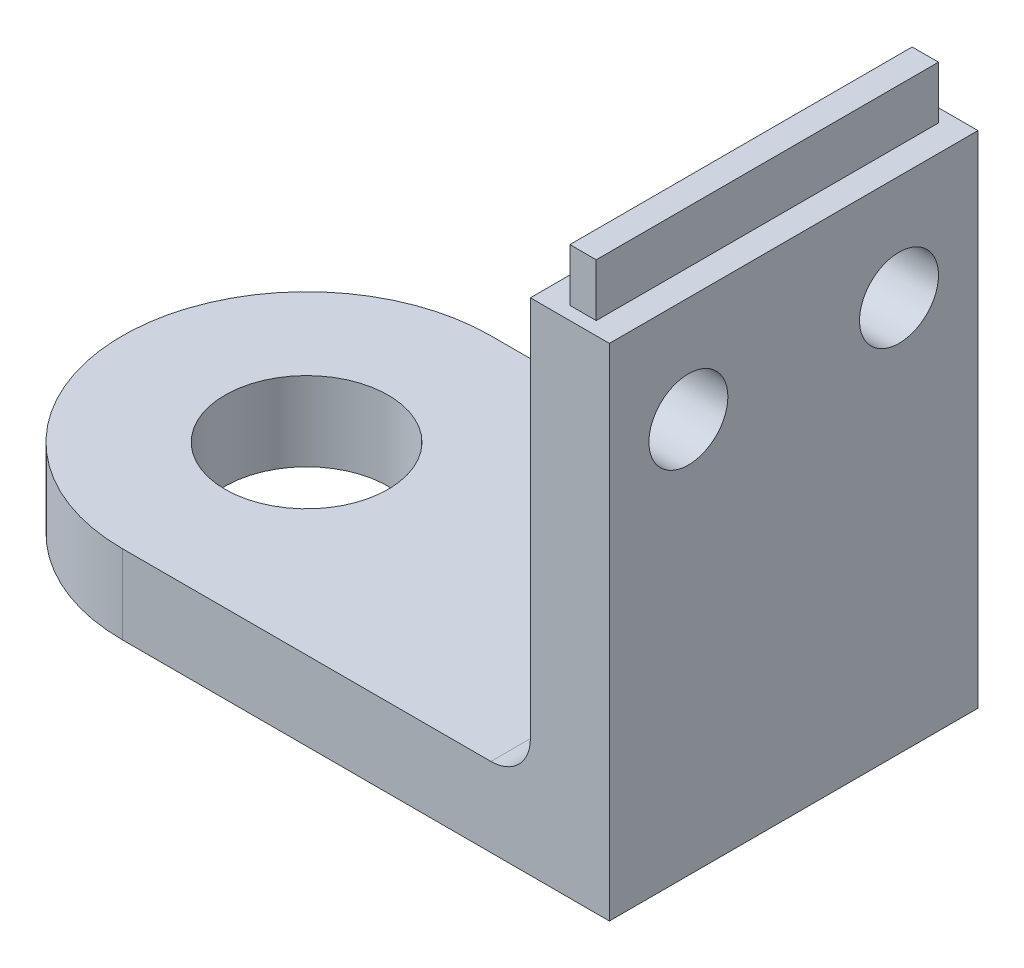
ISO-10303-21;
HEADER;
FILE_DESCRIPTION(('STEP AP214'),'2;1');
FILE_NAME('part.step','',(''),(''),'','','');
FILE_SCHEMA(('AUTOMOTIVE_DESIGN { 1 0 10303 214 1 1 1 1 }'));
ENDSEC;
DATA;
#1=APPLICATION_CONTEXT('core data for automotive mechanical design processes');
#2=APPLICATION_PROTOCOL_DEFINITION('international standard','automotive_design',2000,#1);
#3=PRODUCT_CONTEXT('',#1,'mechanical');
#4=PRODUCT('Part','Part','',(#3));
#5=PRODUCT_RELATED_PRODUCT_CATEGORY('part','',(#4));
#6=PRODUCT_DEFINITION_FORMATION('','',#4);
#7=PRODUCT_DEFINITION_CONTEXT('part definition',#1,'design');
#8=PRODUCT_DEFINITION('design','',#6,#7);
#9=PRODUCT_DEFINITION_SHAPE('','',#8);
#10=(LENGTH_UNIT() NAMED_UNIT(*) SI_UNIT(.MILLI.,.METRE.));
#11=(NAMED_UNIT(*) PLANE_ANGLE_UNIT() SI_UNIT($,.RADIAN.));
#12=(NAMED_UNIT(*) SI_UNIT($,.STERADIAN.) SOLID_ANGLE_UNIT());
#13=UNCERTAINTY_MEASURE_WITH_UNIT(LENGTH_MEASURE(1.E-05),#10,'distance_accuracy_value','');
#14=(GEOMETRIC_REPRESENTATION_CONTEXT(3) GLOBAL_UNCERTAINTY_ASSIGNED_CONTEXT((#13)) GLOBAL_UNIT_ASSIGNED_CONTEXT((#10,
#11,#12)) REPRESENTATION_CONTEXT('',''));
#15=CARTESIAN_POINT('',(0.,0.,0.));
#16=DIRECTION('',(0.,0.,1.));
#17=DIRECTION('',(1.,0.,0.));
#18=AXIS2_PLACEMENT_3D('',#15,#16,#17);
#19=CARTESIAN_POINT('',(21.,0.,7.));
#20=DIRECTION('',(0.,-1.,0.));
#21=DIRECTION('',(0.,0.,-1.));
#22=AXIS2_PLACEMENT_3D('',#19,#20,#21);
#23=PLANE('',#22);
#24=DIRECTION('',(-1.,0.,0.));
#25=VECTOR('',#24,1.);
#26=CARTESIAN_POINT('',(21.,0.,-7.));
#27=LINE('',#26,#25);
#28=CARTESIAN_POINT('',(24.,0.,-7.));
#29=VERTEX_POINT('',#28);
#30=CARTESIAN_POINT('',(21.,0.,-7.));
#31=VERTEX_POINT('',#30);
#32=EDGE_CURVE('E147',#29,#31,#27,.T.);
#33=ORIENTED_EDGE('',*,*,#32,.T.);
#34=DIRECTION('',(0.,0.,-1.));
#35=VECTOR('',#34,1.);
#36=CARTESIAN_POINT('',(21.,0.,7.));
#37=LINE('',#36,#35);
#38=CARTESIAN_POINT('',(21.,0.,7.));
#39=VERTEX_POINT('',#38);
#40=EDGE_CURVE('E156',#39,#31,#37,.T.);
#41=ORIENTED_EDGE('',*,*,#40,.F.);
#42=DIRECTION('',(-1.,0.,0.));
#43=VECTOR('',#42,1.);
#44=CARTESIAN_POINT('',(21.,0.,7.));
#45=LINE('',#44,#43);
#46=CARTESIAN_POINT('',(24.,0.,7.));
#47=VERTEX_POINT('',#46);
#48=EDGE_CURVE('E155',#47,#39,#45,.T.);
#49=ORIENTED_EDGE('',*,*,#48,.F.);
#50=DIRECTION('',(0.,0.,-1.));
#51=VECTOR('',#50,1.);
#52=CARTESIAN_POINT('',(24.,0.,7.));
#53=LINE('',#52,#51);
#54=EDGE_CURVE('E161',#47,#29,#53,.T.);
#55=ORIENTED_EDGE('',*,*,#54,.T.);
#56=EDGE_LOOP('',(#33,#41,#49,#55));
#57=FACE_BOUND('',#56,.T.);
#58=DIRECTION('',(0.,0.,1.));
#59=VECTOR('',#58,1.);
#60=CARTESIAN_POINT('',(22.,0.,6.5));
#61=LINE('',#60,#59);
#62=CARTESIAN_POINT('',(22.,0.,-6.5));
#63=VERTEX_POINT('',#62);
#64=CARTESIAN_POINT('',(22.,0.,6.5));
#65=VERTEX_POINT('',#64);
#66=EDGE_CURVE('E144',#63,#65,#61,.T.);
#67=ORIENTED_EDGE('',*,*,#66,.F.);
#68=DIRECTION('',(-1.,0.,0.));
#69=VECTOR('',#68,1.);
#70=CARTESIAN_POINT('',(22.,0.,-6.5));
#71=LINE('',#70,#69);
#72=CARTESIAN_POINT('',(23.,0.,-6.5));
#73=VERTEX_POINT('',#72);
#74=EDGE_CURVE('E141',#73,#63,#71,.T.);
#75=ORIENTED_EDGE('',*,*,#74,.F.);
#76=DIRECTION('',(0.,0.,-1.));
#77=VECTOR('',#76,1.);
#78=CARTESIAN_POINT('',(23.,0.,6.5));
#79=LINE('',#78,#77);
#80=CARTESIAN_POINT('',(23.,0.,6.5));
#81=VERTEX_POINT('',#80);
#82=EDGE_CURVE('E399',#81,#73,#79,.T.);
#83=ORIENTED_EDGE('',*,*,#82,.F.);
#84=DIRECTION('',(1.,0.,0.));
#85=VECTOR('',#84,1.);
#86=CARTESIAN_POINT('',(22.,0.,6.5));
#87=LINE('',#86,#85);
#88=EDGE_CURVE('E397',#65,#81,#87,.T.);
#89=ORIENTED_EDGE('',*,*,#88,.F.);
#90=EDGE_LOOP('',(#67,#75,#83,#89));
#91=FACE_BOUND('',#90,.T.);
#92=ADVANCED_FACE('F37',(#57,#91),#23,.F.);
#93=CARTESIAN_POINT('',(5.5,-16.,0.));
#94=DIRECTION('',(0.,1.,0.));
#95=DIRECTION('',(0.,0.,1.));
#96=AXIS2_PLACEMENT_3D('',#93,#94,#95);
#97=PLANE('',#96);
#98=CARTESIAN_POINT('',(5.5,-16.,0.));
#99=DIRECTION('',(0.,1.,0.));
#100=DIRECTION('',(0.,0.,1.));
#101=AXIS2_PLACEMENT_3D('',#98,#99,#100);
#102=CIRCLE('',#101,3.1);
#103=CARTESIAN_POINT('',(5.5,-16.,3.1));
#104=VERTEX_POINT('',#103);
#105=EDGE_CURVE('E386',#104,#104,#102,.T.);
#106=ORIENTED_EDGE('',*,*,#105,.F.);
#107=EDGE_LOOP('',(#106));
#108=FACE_BOUND('',#107,.T.);
#109=DIRECTION('',(1.,0.,0.));
#110=VECTOR('',#109,1.);
#111=CARTESIAN_POINT('',(5.5,-16.,7.));
#112=LINE('',#111,#110);
#113=CARTESIAN_POINT('',(5.5,-16.,7.));
#114=VERTEX_POINT('',#113);
#115=CARTESIAN_POINT('',(19.5,-16.,7.));
#116=VERTEX_POINT('',#115);
#117=EDGE_CURVE('E168',#114,#116,#112,.T.);
#118=ORIENTED_EDGE('',*,*,#117,.T.);
#119=DIRECTION('',(0.,0.,-1.));
#120=VECTOR('',#119,1.);
#121=CARTESIAN_POINT('',(19.5,-16.,0.));
#122=LINE('',#121,#120);
#123=CARTESIAN_POINT('',(19.5,-16.,-7.));
#124=VERTEX_POINT('',#123);
#125=EDGE_CURVE('E193',#116,#124,#122,.T.);
#126=ORIENTED_EDGE('',*,*,#125,.T.);
#127=DIRECTION('',(-1.,0.,0.));
#128=VECTOR('',#127,1.);
#129=CARTESIAN_POINT('',(24.,-16.,-7.));
#130=LINE('',#129,#128);
#131=CARTESIAN_POINT('',(5.5,-16.,-7.));
#132=VERTEX_POINT('',#131);
#133=EDGE_CURVE('E172',#124,#132,#130,.T.);
#134=ORIENTED_EDGE('',*,*,#133,.T.);
#135=CARTESIAN_POINT('',(5.5,-16.,0.));
#136=DIRECTION('',(0.,1.,0.));
#137=DIRECTION('',(0.,0.,1.));
#138=AXIS2_PLACEMENT_3D('',#135,#136,#137);
#139=CIRCLE('',#138,7.);
#140=EDGE_CURVE('E165',#132,#114,#139,.T.);
#141=ORIENTED_EDGE('',*,*,#140,.T.);
#142=EDGE_LOOP('',(#118,#126,#134,#141));
#143=FACE_BOUND('',#142,.T.);
#144=ADVANCED_FACE('F198',(#108,#143),#97,.T.);
#145=CARTESIAN_POINT('',(5.5,-16.,0.));
#146=DIRECTION('',(0.,-1.,0.));
#147=DIRECTION('',(0.,0.,-1.));
#148=AXIS2_PLACEMENT_3D('',#145,#146,#147);
#149=CYLINDRICAL_SURFACE('',#148,7.);
#150=CARTESIAN_POINT('',(5.5,-19.,0.));
#151=DIRECTION('',(0.,1.,0.));
#152=DIRECTION('',(0.,0.,1.));
#153=AXIS2_PLACEMENT_3D('',#150,#151,#152);
#154=CIRCLE('',#153,7.);
#155=CARTESIAN_POINT('',(5.5,-19.,-7.));
#156=VERTEX_POINT('',#155);
#157=CARTESIAN_POINT('',(5.5,-19.,7.));
#158=VERTEX_POINT('',#157);
#159=EDGE_CURVE('E164',#156,#158,#154,.T.);
#160=ORIENTED_EDGE('',*,*,#159,.T.);
#161=DIRECTION('',(0.,-1.,0.));
#162=VECTOR('',#161,1.);
#163=CARTESIAN_POINT('',(5.5,-16.,7.));
#164=LINE('',#163,#162);
#165=EDGE_CURVE('E190',#114,#158,#164,.T.);
#166=ORIENTED_EDGE('',*,*,#165,.F.);
#167=ORIENTED_EDGE('',*,*,#140,.F.);
#168=DIRECTION('',(0.,-1.,0.));
#169=VECTOR('',#168,1.);
#170=CARTESIAN_POINT('',(5.5,-16.,-7.));
#171=LINE('',#170,#169);
#172=EDGE_CURVE('E174',#132,#156,#171,.T.);
#173=ORIENTED_EDGE('',*,*,#172,.T.);
#174=EDGE_LOOP('',(#160,#166,#167,#173));
#175=FACE_BOUND('',#174,.T.);
#176=ADVANCED_FACE('F208',(#175),#149,.T.);
#177=CARTESIAN_POINT('',(5.5,-16.,7.));
#178=DIRECTION('',(0.,0.,-1.));
#179=DIRECTION('',(-1.,0.,0.));
#180=AXIS2_PLACEMENT_3D('',#177,#178,#179);
#181=PLANE('',#180);
#182=DIRECTION('',(0.,-1.,0.));
#183=VECTOR('',#182,1.);
#184=CARTESIAN_POINT('',(24.,-16.,7.));
#185=LINE('',#184,#183);
#186=CARTESIAN_POINT('',(24.,-19.,7.));
#187=VERTEX_POINT('',#186);
#188=EDGE_CURVE('E187',#47,#187,#185,.T.);
#189=ORIENTED_EDGE('',*,*,#188,.F.);
#190=ORIENTED_EDGE('',*,*,#48,.T.);
#191=DIRECTION('',(0.,-1.,0.));
#192=VECTOR('',#191,1.);
#193=CARTESIAN_POINT('',(21.,-19.,7.));
#194=LINE('',#193,#192);
#195=CARTESIAN_POINT('',(21.,-14.5,7.));
#196=VERTEX_POINT('',#195);
#197=EDGE_CURVE('E153',#39,#196,#194,.T.);
#198=ORIENTED_EDGE('',*,*,#197,.T.);
#199=CARTESIAN_POINT('',(19.5,-14.5,7.));
#200=DIRECTION('',(0.,0.,-1.));
#201=DIRECTION('',(-1.,0.,0.));
#202=AXIS2_PLACEMENT_3D('',#199,#200,#201);
#203=CIRCLE('',#202,1.5);
#204=EDGE_CURVE('E11',#196,#116,#203,.T.);
#205=ORIENTED_EDGE('',*,*,#204,.T.);
#206=ORIENTED_EDGE('',*,*,#117,.F.);
#207=ORIENTED_EDGE('',*,*,#165,.T.);
#208=DIRECTION('',(1.,0.,0.));
#209=VECTOR('',#208,1.);
#210=CARTESIAN_POINT('',(5.5,-19.,7.));
#211=LINE('',#210,#209);
#212=EDGE_CURVE('E177',#158,#187,#211,.T.);
#213=ORIENTED_EDGE('',*,*,#212,.T.);
#214=EDGE_LOOP('',(#189,#190,#198,#205,#206,#207,#213));
#215=FACE_BOUND('',#214,.T.);
#216=ADVANCED_FACE('F210',(#215),#181,.F.);
#217=CARTESIAN_POINT('',(24.,-16.,7.));
#218=DIRECTION('',(-1.,0.,0.));
#219=DIRECTION('',(0.,0.,1.));
#220=AXIS2_PLACEMENT_3D('',#217,#218,#219);
#221=PLANE('',#220);
#222=CARTESIAN_POINT('',(24.,-4.,4.));
#223=DIRECTION('',(1.,0.,0.));
#224=DIRECTION('',(0.,0.,-1.));
#225=AXIS2_PLACEMENT_3D('',#222,#223,#224);
#226=CIRCLE('',#225,1.5);
#227=CARTESIAN_POINT('',(24.,-4.,2.5));
#228=VERTEX_POINT('',#227);
#229=EDGE_CURVE('E382',#228,#228,#226,.T.);
#230=ORIENTED_EDGE('',*,*,#229,.F.);
#231=EDGE_LOOP('',(#230));
#232=FACE_BOUND('',#231,.T.);
#233=CARTESIAN_POINT('',(24.,-4.,-4.));
#234=DIRECTION('',(1.,0.,0.));
#235=DIRECTION('',(0.,0.,-1.));
#236=AXIS2_PLACEMENT_3D('',#233,#234,#235);
#237=CIRCLE('',#236,1.5);
#238=CARTESIAN_POINT('',(24.,-4.,-5.5));
#239=VERTEX_POINT('',#238);
#240=EDGE_CURVE('E379',#239,#239,#237,.T.);
#241=ORIENTED_EDGE('',*,*,#240,.F.);
#242=EDGE_LOOP('',(#241));
#243=FACE_BOUND('',#242,.T.);
#244=DIRECTION('',(0.,0.,-1.));
#245=VECTOR('',#244,1.);
#246=CARTESIAN_POINT('',(24.,-19.,7.));
#247=LINE('',#246,#245);
#248=CARTESIAN_POINT('',(24.,-19.,-7.));
#249=VERTEX_POINT('',#248);
#250=EDGE_CURVE('E179',#187,#249,#247,.T.);
#251=ORIENTED_EDGE('',*,*,#250,.T.);
#252=DIRECTION('',(0.,-1.,0.));
#253=VECTOR('',#252,1.);
#254=CARTESIAN_POINT('',(24.,-16.,-7.));
#255=LINE('',#254,#253);
#256=EDGE_CURVE('E184',#29,#249,#255,.T.);
#257=ORIENTED_EDGE('',*,*,#256,.F.);
#258=ORIENTED_EDGE('',*,*,#54,.F.);
#259=ORIENTED_EDGE('',*,*,#188,.T.);
#260=EDGE_LOOP('',(#251,#257,#258,#259));
#261=FACE_BOUND('',#260,.T.);
#262=ADVANCED_FACE('F241',(#232,#243,#261),#221,.F.);
#263=CARTESIAN_POINT('',(24.,-16.,-7.));
#264=DIRECTION('',(0.,0.,1.));
#265=DIRECTION('',(1.,0.,0.));
#266=AXIS2_PLACEMENT_3D('',#263,#264,#265);
#267=PLANE('',#266);
#268=DIRECTION('',(-1.,0.,0.));
#269=VECTOR('',#268,1.);
#270=CARTESIAN_POINT('',(24.,-19.,-7.));
#271=LINE('',#270,#269);
#272=EDGE_CURVE('E169',#249,#156,#271,.T.);
#273=ORIENTED_EDGE('',*,*,#272,.T.);
#274=ORIENTED_EDGE('',*,*,#172,.F.);
#275=ORIENTED_EDGE('',*,*,#133,.F.);
#276=CARTESIAN_POINT('',(19.5,-14.5,-7.));
#277=DIRECTION('',(0.,0.,1.));
#278=DIRECTION('',(1.,0.,0.));
#279=AXIS2_PLACEMENT_3D('',#276,#277,#278);
#280=CIRCLE('',#279,1.5);
#281=CARTESIAN_POINT('',(21.,-14.5,-7.));
#282=VERTEX_POINT('',#281);
#283=EDGE_CURVE('E45',#124,#282,#280,.T.);
#284=ORIENTED_EDGE('',*,*,#283,.T.);
#285=DIRECTION('',(0.,-1.,0.));
#286=VECTOR('',#285,1.);
#287=CARTESIAN_POINT('',(21.,-19.,-7.));
#288=LINE('',#287,#286);
#289=EDGE_CURVE('E145',#31,#282,#288,.T.);
#290=ORIENTED_EDGE('',*,*,#289,.F.);
#291=ORIENTED_EDGE('',*,*,#32,.F.);
#292=ORIENTED_EDGE('',*,*,#256,.T.);
#293=EDGE_LOOP('',(#273,#274,#275,#284,#290,#291,#292));
#294=FACE_BOUND('',#293,.T.);
#295=ADVANCED_FACE('F202',(#294),#267,.F.);
#296=CARTESIAN_POINT('',(5.5,-19.,0.));
#297=DIRECTION('',(0.,1.,0.));
#298=DIRECTION('',(0.,0.,1.));
#299=AXIS2_PLACEMENT_3D('',#296,#297,#298);
#300=PLANE('',#299);
#301=CARTESIAN_POINT('',(5.5,-19.,0.));
#302=DIRECTION('',(0.,1.,0.));
#303=DIRECTION('',(0.,0.,1.));
#304=AXIS2_PLACEMENT_3D('',#301,#302,#303);
#305=CIRCLE('',#304,3.1);
#306=CARTESIAN_POINT('',(5.5,-19.,3.1));
#307=VERTEX_POINT('',#306);
#308=EDGE_CURVE('E389',#307,#307,#305,.T.);
#309=ORIENTED_EDGE('',*,*,#308,.T.);
#310=EDGE_LOOP('',(#309));
#311=FACE_BOUND('',#310,.T.);
#312=ORIENTED_EDGE('',*,*,#250,.F.);
#313=ORIENTED_EDGE('',*,*,#212,.F.);
#314=ORIENTED_EDGE('',*,*,#159,.F.);
#315=ORIENTED_EDGE('',*,*,#272,.F.);
#316=EDGE_LOOP('',(#312,#313,#314,#315));
#317=FACE_BOUND('',#316,.T.);
#318=ADVANCED_FACE('F233',(#311,#317),#300,.F.);
#319=CARTESIAN_POINT('',(21.,-19.,7.));
#320=DIRECTION('',(1.,0.,0.));
#321=DIRECTION('',(0.,0.,-1.));
#322=AXIS2_PLACEMENT_3D('',#319,#320,#321);
#323=PLANE('',#322);
#324=CARTESIAN_POINT('',(21.,-4.,4.));
#325=DIRECTION('',(1.,0.,0.));
#326=DIRECTION('',(0.,0.,-1.));
#327=AXIS2_PLACEMENT_3D('',#324,#325,#326);
#328=CIRCLE('',#327,1.5);
#329=CARTESIAN_POINT('',(21.,-4.,2.5));
#330=VERTEX_POINT('',#329);
#331=EDGE_CURVE('E391',#330,#330,#328,.T.);
#332=ORIENTED_EDGE('',*,*,#331,.T.);
#333=EDGE_LOOP('',(#332));
#334=FACE_BOUND('',#333,.T.);
#335=CARTESIAN_POINT('',(21.,-4.,-4.));
#336=DIRECTION('',(1.,0.,0.));
#337=DIRECTION('',(0.,0.,-1.));
#338=AXIS2_PLACEMENT_3D('',#335,#336,#337);
#339=CIRCLE('',#338,1.5);
#340=CARTESIAN_POINT('',(21.,-4.,-5.5));
#341=VERTEX_POINT('',#340);
#342=EDGE_CURVE('E376',#341,#341,#339,.T.);
#343=ORIENTED_EDGE('',*,*,#342,.T.);
#344=EDGE_LOOP('',(#343));
#345=FACE_BOUND('',#344,.T.);
#346=ORIENTED_EDGE('',*,*,#289,.T.);
#347=DIRECTION('',(0.,0.,-1.));
#348=VECTOR('',#347,1.);
#349=CARTESIAN_POINT('',(21.,-14.5,7.));
#350=LINE('',#349,#348);
#351=EDGE_CURVE('E58',#282,#196,#350,.F.);
#352=ORIENTED_EDGE('',*,*,#351,.T.);
#353=ORIENTED_EDGE('',*,*,#197,.F.);
#354=ORIENTED_EDGE('',*,*,#40,.T.);
#355=EDGE_LOOP('',(#346,#352,#353,#354));
#356=FACE_BOUND('',#355,.T.);
#357=ADVANCED_FACE('F231',(#334,#345,#356),#323,.F.);
#358=CARTESIAN_POINT('',(22.,2.,6.5));
#359=DIRECTION('',(1.,0.,0.));
#360=DIRECTION('',(0.,0.,-1.));
#361=AXIS2_PLACEMENT_3D('',#358,#359,#360);
#362=PLANE('',#361);
#363=ORIENTED_EDGE('',*,*,#66,.T.);
#364=DIRECTION('',(0.,-1.,0.));
#365=VECTOR('',#364,1.);
#366=CARTESIAN_POINT('',(22.,2.,6.5));
#367=LINE('',#366,#365);
#368=CARTESIAN_POINT('',(22.,2.,6.5));
#369=VERTEX_POINT('',#368);
#370=EDGE_CURVE('E125',#369,#65,#367,.T.);
#371=ORIENTED_EDGE('',*,*,#370,.F.);
#372=DIRECTION('',(0.,0.,1.));
#373=VECTOR('',#372,1.);
#374=CARTESIAN_POINT('',(22.,2.,6.5));
#375=LINE('',#374,#373);
#376=CARTESIAN_POINT('',(22.,2.,-6.5));
#377=VERTEX_POINT('',#376);
#378=EDGE_CURVE('E132',#377,#369,#375,.T.);
#379=ORIENTED_EDGE('',*,*,#378,.F.);
#380=DIRECTION('',(0.,-1.,0.));
#381=VECTOR('',#380,1.);
#382=CARTESIAN_POINT('',(22.,2.,-6.5));
#383=LINE('',#382,#381);
#384=EDGE_CURVE('E395',#377,#63,#383,.T.);
#385=ORIENTED_EDGE('',*,*,#384,.T.);
#386=EDGE_LOOP('',(#363,#371,#379,#385));
#387=FACE_BOUND('',#386,.T.);
#388=ADVANCED_FACE('F143',(#387),#362,.F.);
#389=CARTESIAN_POINT('',(22.,2.,6.5));
#390=DIRECTION('',(0.,0.,-1.));
#391=DIRECTION('',(-1.,0.,0.));
#392=AXIS2_PLACEMENT_3D('',#389,#390,#391);
#393=PLANE('',#392);
#394=ORIENTED_EDGE('',*,*,#88,.T.);
#395=DIRECTION('',(0.,-1.,0.));
#396=VECTOR('',#395,1.);
#397=CARTESIAN_POINT('',(23.,2.,6.5));
#398=LINE('',#397,#396);
#399=CARTESIAN_POINT('',(23.,2.,6.5));
#400=VERTEX_POINT('',#399);
#401=EDGE_CURVE('E128',#400,#81,#398,.T.);
#402=ORIENTED_EDGE('',*,*,#401,.F.);
#403=DIRECTION('',(1.,0.,0.));
#404=VECTOR('',#403,1.);
#405=CARTESIAN_POINT('',(22.,2.,6.5));
#406=LINE('',#405,#404);
#407=EDGE_CURVE('E120',#369,#400,#406,.T.);
#408=ORIENTED_EDGE('',*,*,#407,.F.);
#409=ORIENTED_EDGE('',*,*,#370,.T.);
#410=EDGE_LOOP('',(#394,#402,#408,#409));
#411=FACE_BOUND('',#410,.T.);
#412=ADVANCED_FACE('F123',(#411),#393,.F.);
#413=CARTESIAN_POINT('',(23.,2.,6.5));
#414=DIRECTION('',(-1.,0.,0.));
#415=DIRECTION('',(0.,0.,1.));
#416=AXIS2_PLACEMENT_3D('',#413,#414,#415);
#417=PLANE('',#416);
#418=ORIENTED_EDGE('',*,*,#82,.T.);
#419=DIRECTION('',(0.,-1.,0.));
#420=VECTOR('',#419,1.);
#421=CARTESIAN_POINT('',(23.,2.,-6.5));
#422=LINE('',#421,#420);
#423=CARTESIAN_POINT('',(23.,2.,-6.5));
#424=VERTEX_POINT('',#423);
#425=EDGE_CURVE('E149',#424,#73,#422,.T.);
#426=ORIENTED_EDGE('',*,*,#425,.F.);
#427=DIRECTION('',(0.,0.,-1.));
#428=VECTOR('',#427,1.);
#429=CARTESIAN_POINT('',(23.,2.,6.5));
#430=LINE('',#429,#428);
#431=EDGE_CURVE('E131',#400,#424,#430,.T.);
#432=ORIENTED_EDGE('',*,*,#431,.F.);
#433=ORIENTED_EDGE('',*,*,#401,.T.);
#434=EDGE_LOOP('',(#418,#426,#432,#433));
#435=FACE_BOUND('',#434,.T.);
#436=ADVANCED_FACE('F285',(#435),#417,.F.);
#437=CARTESIAN_POINT('',(22.,2.,-6.5));
#438=DIRECTION('',(0.,0.,1.));
#439=DIRECTION('',(1.,0.,0.));
#440=AXIS2_PLACEMENT_3D('',#437,#438,#439);
#441=PLANE('',#440);
#442=ORIENTED_EDGE('',*,*,#74,.T.);
#443=ORIENTED_EDGE('',*,*,#384,.F.);
#444=DIRECTION('',(-1.,0.,0.));
#445=VECTOR('',#444,1.);
#446=CARTESIAN_POINT('',(22.,2.,-6.5));
#447=LINE('',#446,#445);
#448=EDGE_CURVE('E137',#424,#377,#447,.T.);
#449=ORIENTED_EDGE('',*,*,#448,.F.);
#450=ORIENTED_EDGE('',*,*,#425,.T.);
#451=EDGE_LOOP('',(#442,#443,#449,#450));
#452=FACE_BOUND('',#451,.T.);
#453=ADVANCED_FACE('F291',(#452),#441,.F.);
#454=CARTESIAN_POINT('',(0.,2.,0.));
#455=DIRECTION('',(0.,-1.,0.));
#456=DIRECTION('',(0.,0.,-1.));
#457=AXIS2_PLACEMENT_3D('',#454,#455,#456);
#458=PLANE('',#457);
#459=ORIENTED_EDGE('',*,*,#378,.T.);
#460=ORIENTED_EDGE('',*,*,#407,.T.);
#461=ORIENTED_EDGE('',*,*,#431,.T.);
#462=ORIENTED_EDGE('',*,*,#448,.T.);
#463=EDGE_LOOP('',(#459,#460,#461,#462));
#464=FACE_BOUND('',#463,.T.);
#465=ADVANCED_FACE('F135',(#464),#458,.F.);
#466=CARTESIAN_POINT('',(5.5,-16.,0.));
#467=DIRECTION('',(0.,-1.,0.));
#468=DIRECTION('',(0.,0.,-1.));
#469=AXIS2_PLACEMENT_3D('',#466,#467,#468);
#470=CYLINDRICAL_SURFACE('',#469,3.1);
#471=ORIENTED_EDGE('',*,*,#105,.T.);
#472=EDGE_LOOP('',(#471));
#473=FACE_BOUND('',#472,.T.);
#474=ORIENTED_EDGE('',*,*,#308,.F.);
#475=EDGE_LOOP('',(#474));
#476=FACE_BOUND('',#475,.T.);
#477=ADVANCED_FACE('F305',(#473,#476),#470,.F.);
#478=CARTESIAN_POINT('',(21.,-4.,-4.));
#479=DIRECTION('',(1.,0.,0.));
#480=DIRECTION('',(0.,0.,-1.));
#481=AXIS2_PLACEMENT_3D('',#478,#479,#480);
#482=CYLINDRICAL_SURFACE('',#481,1.5);
#483=ORIENTED_EDGE('',*,*,#342,.F.);
#484=EDGE_LOOP('',(#483));
#485=FACE_BOUND('',#484,.T.);
#486=ORIENTED_EDGE('',*,*,#240,.T.);
#487=EDGE_LOOP('',(#486));
#488=FACE_BOUND('',#487,.T.);
#489=ADVANCED_FACE('F216',(#485,#488),#482,.F.);
#490=CARTESIAN_POINT('',(21.,-4.,4.));
#491=DIRECTION('',(1.,0.,0.));
#492=DIRECTION('',(0.,0.,-1.));
#493=AXIS2_PLACEMENT_3D('',#490,#491,#492);
#494=CYLINDRICAL_SURFACE('',#493,1.5);
#495=ORIENTED_EDGE('',*,*,#331,.F.);
#496=EDGE_LOOP('',(#495));
#497=FACE_BOUND('',#496,.T.);
#498=ORIENTED_EDGE('',*,*,#229,.T.);
#499=EDGE_LOOP('',(#498));
#500=FACE_BOUND('',#499,.T.);
#501=ADVANCED_FACE('F212',(#497,#500),#494,.F.);
#502=CARTESIAN_POINT('',(19.5,-14.5,0.));
#503=DIRECTION('',(0.,0.,-1.));
#504=DIRECTION('',(-1.,0.,0.));
#505=AXIS2_PLACEMENT_3D('',#502,#503,#504);
#506=CYLINDRICAL_SURFACE('',#505,1.5);
#507=ORIENTED_EDGE('',*,*,#204,.F.);
#508=ORIENTED_EDGE('',*,*,#351,.F.);
#509=ORIENTED_EDGE('',*,*,#283,.F.);
#510=ORIENTED_EDGE('',*,*,#125,.F.);
#511=EDGE_LOOP('',(#507,#508,#509,#510));
#512=FACE_BOUND('',#511,.T.);
#513=ADVANCED_FACE('F39',(#512),#506,.F.);
#514=CLOSED_SHELL('',(#92,#144,#176,#216,#262,#295,#318,#357,#388,#412,#436,#453,#465,#477,#489,
#501,#513));
#515=MANIFOLD_SOLID_BREP('B2',#514);
#516=ADVANCED_BREP_SHAPE_REPRESENTATION('',(#18,#515),#14);
#517=SHAPE_DEFINITION_REPRESENTATION(#9,#516);
ENDSEC;
END-ISO-10303-21;
